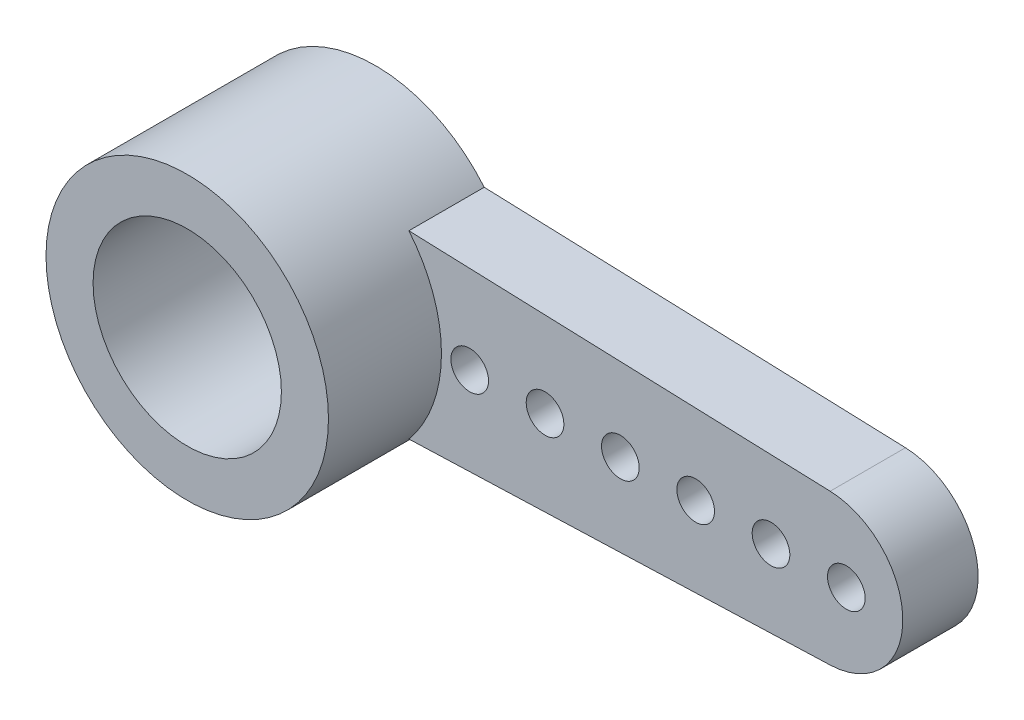
ISO-10303-21;
HEADER;
FILE_DESCRIPTION(('STEP AP214'),'2;1');
FILE_NAME('part.step','',(''),(''),'','','');
FILE_SCHEMA(('AUTOMOTIVE_DESIGN { 1 0 10303 214 1 1 1 1 }'));
ENDSEC;
DATA;
#1=APPLICATION_CONTEXT('core data for automotive mechanical design processes');
#2=APPLICATION_PROTOCOL_DEFINITION('international standard','automotive_design',2000,#1);
#3=PRODUCT_CONTEXT('',#1,'mechanical');
#4=PRODUCT('Part','Part','',(#3));
#5=PRODUCT_RELATED_PRODUCT_CATEGORY('part','',(#4));
#6=PRODUCT_DEFINITION_FORMATION('','',#4);
#7=PRODUCT_DEFINITION_CONTEXT('part definition',#1,'design');
#8=PRODUCT_DEFINITION('design','',#6,#7);
#9=PRODUCT_DEFINITION_SHAPE('','',#8);
#10=(LENGTH_UNIT() NAMED_UNIT(*) SI_UNIT(.MILLI.,.METRE.));
#11=(NAMED_UNIT(*) PLANE_ANGLE_UNIT() SI_UNIT($,.RADIAN.));
#12=(NAMED_UNIT(*) SI_UNIT($,.STERADIAN.) SOLID_ANGLE_UNIT());
#13=UNCERTAINTY_MEASURE_WITH_UNIT(LENGTH_MEASURE(1.E-05),#10,'distance_accuracy_value','');
#14=(GEOMETRIC_REPRESENTATION_CONTEXT(3) GLOBAL_UNCERTAINTY_ASSIGNED_CONTEXT((#13)) GLOBAL_UNIT_ASSIGNED_CONTEXT((#10,
#11,#12)) REPRESENTATION_CONTEXT('',''));
#15=CARTESIAN_POINT('',(0.,0.,0.));
#16=DIRECTION('',(0.,0.,1.));
#17=DIRECTION('',(1.,0.,0.));
#18=AXIS2_PLACEMENT_3D('',#15,#16,#17);
#19=CARTESIAN_POINT('',(0.,0.,0.));
#20=DIRECTION('',(0.,0.,1.));
#21=DIRECTION('',(1.,0.,0.));
#22=AXIS2_PLACEMENT_3D('',#19,#20,#21);
#23=PLANE('',#22);
#24=CARTESIAN_POINT('',(14.5,0.,0.));
#25=DIRECTION('',(0.,0.,-1.));
#26=DIRECTION('',(-1.,0.,0.));
#27=AXIS2_PLACEMENT_3D('',#24,#25,#26);
#28=CIRCLE('',#27,0.500000000000001);
#29=CARTESIAN_POINT('',(14.,0.,0.));
#30=VERTEX_POINT('',#29);
#31=EDGE_CURVE('E132',#30,#30,#28,.T.);
#32=ORIENTED_EDGE('',*,*,#31,.F.);
#33=EDGE_LOOP('',(#32));
#34=FACE_BOUND('',#33,.T.);
#35=CARTESIAN_POINT('',(10.5,0.,0.));
#36=DIRECTION('',(0.,0.,-1.));
#37=DIRECTION('',(-1.,0.,0.));
#38=AXIS2_PLACEMENT_3D('',#35,#36,#37);
#39=CIRCLE('',#38,0.500000000000001);
#40=CARTESIAN_POINT('',(10.,0.,0.));
#41=VERTEX_POINT('',#40);
#42=EDGE_CURVE('E135',#41,#41,#39,.T.);
#43=ORIENTED_EDGE('',*,*,#42,.F.);
#44=EDGE_LOOP('',(#43));
#45=FACE_BOUND('',#44,.T.);
#46=CARTESIAN_POINT('',(8.5,0.,0.));
#47=DIRECTION('',(0.,0.,-1.));
#48=DIRECTION('',(-1.,0.,0.));
#49=AXIS2_PLACEMENT_3D('',#46,#47,#48);
#50=CIRCLE('',#49,0.500000000000001);
#51=CARTESIAN_POINT('',(8.,0.,0.));
#52=VERTEX_POINT('',#51);
#53=EDGE_CURVE('E141',#52,#52,#50,.T.);
#54=ORIENTED_EDGE('',*,*,#53,.F.);
#55=EDGE_LOOP('',(#54));
#56=FACE_BOUND('',#55,.T.);
#57=CARTESIAN_POINT('',(6.5,0.,0.));
#58=DIRECTION('',(0.,0.,-1.));
#59=DIRECTION('',(-1.,0.,0.));
#60=AXIS2_PLACEMENT_3D('',#57,#58,#59);
#61=CIRCLE('',#60,0.500000000000001);
#62=CARTESIAN_POINT('',(6.,0.,0.));
#63=VERTEX_POINT('',#62);
#64=EDGE_CURVE('E147',#63,#63,#61,.T.);
#65=ORIENTED_EDGE('',*,*,#64,.F.);
#66=EDGE_LOOP('',(#65));
#67=FACE_BOUND('',#66,.T.);
#68=CARTESIAN_POINT('',(4.5,0.,0.));
#69=DIRECTION('',(0.,0.,-1.));
#70=DIRECTION('',(-1.,0.,0.));
#71=AXIS2_PLACEMENT_3D('',#68,#69,#70);
#72=CIRCLE('',#71,0.500000000000001);
#73=CARTESIAN_POINT('',(4.,0.,0.));
#74=VERTEX_POINT('',#73);
#75=EDGE_CURVE('E153',#74,#74,#72,.T.);
#76=ORIENTED_EDGE('',*,*,#75,.F.);
#77=EDGE_LOOP('',(#76));
#78=FACE_BOUND('',#77,.T.);
#79=CARTESIAN_POINT('',(12.5,0.,0.));
#80=DIRECTION('',(0.,0.,-1.));
#81=DIRECTION('',(-1.,0.,0.));
#82=AXIS2_PLACEMENT_3D('',#79,#80,#81);
#83=CIRCLE('',#82,0.500000000000001);
#84=CARTESIAN_POINT('',(12.,0.,0.));
#85=VERTEX_POINT('',#84);
#86=EDGE_CURVE('E159',#85,#85,#83,.T.);
#87=ORIENTED_EDGE('',*,*,#86,.F.);
#88=EDGE_LOOP('',(#87));
#89=FACE_BOUND('',#88,.T.);
#90=CARTESIAN_POINT('',(0.,0.,0.));
#91=DIRECTION('',(0.,0.,-1.));
#92=DIRECTION('',(-1.,0.,0.));
#93=AXIS2_PLACEMENT_3D('',#90,#91,#92);
#94=CIRCLE('',#93,2.5);
#95=CARTESIAN_POINT('',(-2.5,0.,0.));
#96=VERTEX_POINT('',#95);
#97=EDGE_CURVE('E171',#96,#96,#94,.T.);
#98=ORIENTED_EDGE('',*,*,#97,.F.);
#99=EDGE_LOOP('',(#98));
#100=FACE_BOUND('',#99,.T.);
#101=CARTESIAN_POINT('',(0.,0.,0.));
#102=DIRECTION('',(0.,0.,-1.));
#103=DIRECTION('',(-1.,0.,0.));
#104=AXIS2_PLACEMENT_3D('',#101,#102,#103);
#105=CIRCLE('',#104,3.75);
#106=CARTESIAN_POINT('',(2.88547071027724,-2.39511143376089,0.));
#107=VERTEX_POINT('',#106);
#108=CARTESIAN_POINT('',(2.88547071027724,2.39511143376089,0.));
#109=VERTEX_POINT('',#108);
#110=EDGE_CURVE('E45',#107,#109,#105,.T.);
#111=ORIENTED_EDGE('',*,*,#110,.T.);
#112=DIRECTION('',(-0.999372730394994,0.0354139201848023,0.));
#113=VECTOR('',#112,1.);
#114=CARTESIAN_POINT('',(0.0883858807695825,2.49422934631706,0.));
#115=LINE('',#114,#113);
#116=CARTESIAN_POINT('',(14.0708278403696,1.99874546078999,0.));
#117=VERTEX_POINT('',#116);
#118=EDGE_CURVE('E83',#117,#109,#115,.T.);
#119=ORIENTED_EDGE('',*,*,#118,.F.);
#120=CARTESIAN_POINT('',(14.,0.,0.));
#121=DIRECTION('',(0.,0.,1.));
#122=DIRECTION('',(1.,0.,0.));
#123=AXIS2_PLACEMENT_3D('',#120,#121,#122);
#124=CIRCLE('',#123,2.);
#125=CARTESIAN_POINT('',(14.0708278403696,-1.99874546078998,0.));
#126=VERTEX_POINT('',#125);
#127=EDGE_CURVE('E74',#126,#117,#124,.T.);
#128=ORIENTED_EDGE('',*,*,#127,.F.);
#129=DIRECTION('',(-0.999372730394994,-0.0354139201848029,0.));
#130=VECTOR('',#129,1.);
#131=CARTESIAN_POINT('',(0.0883858807695838,-2.49422934631706,0.));
#132=LINE('',#131,#130);
#133=EDGE_CURVE('E86',#126,#107,#132,.T.);
#134=ORIENTED_EDGE('',*,*,#133,.T.);
#135=EDGE_LOOP('',(#111,#119,#128,#134));
#136=FACE_BOUND('',#135,.T.);
#137=ADVANCED_FACE('F41',(#34,#45,#56,#67,#78,#89,#100,#136),#23,.F.);
#138=CARTESIAN_POINT('',(0.,0.,0.));
#139=DIRECTION('',(0.,0.,1.));
#140=DIRECTION('',(1.,0.,0.));
#141=AXIS2_PLACEMENT_3D('',#138,#139,#140);
#142=CYLINDRICAL_SURFACE('',#141,2.5);
#143=CARTESIAN_POINT('',(0.,0.,5.));
#144=DIRECTION('',(0.,0.,1.));
#145=DIRECTION('',(1.,0.,0.));
#146=AXIS2_PLACEMENT_3D('',#143,#144,#145);
#147=CIRCLE('',#146,2.5);
#148=CARTESIAN_POINT('',(2.5,0.,5.));
#149=VERTEX_POINT('',#148);
#150=EDGE_CURVE('E128',#149,#149,#147,.T.);
#151=ORIENTED_EDGE('',*,*,#150,.T.);
#152=EDGE_LOOP('',(#151));
#153=FACE_BOUND('',#152,.T.);
#154=CARTESIAN_POINT('',(0.,0.,1.));
#155=DIRECTION('',(0.,0.,-1.));
#156=DIRECTION('',(-1.,0.,0.));
#157=AXIS2_PLACEMENT_3D('',#154,#155,#156);
#158=CIRCLE('',#157,2.5);
#159=CARTESIAN_POINT('',(-2.5,0.,1.));
#160=VERTEX_POINT('',#159);
#161=EDGE_CURVE('E165',#160,#160,#158,.T.);
#162=ORIENTED_EDGE('',*,*,#161,.T.);
#163=EDGE_LOOP('',(#162));
#164=FACE_BOUND('',#163,.T.);
#165=ADVANCED_FACE('F200',(#153,#164),#142,.F.);
#166=CARTESIAN_POINT('',(0.0883858807695838,-2.49422934631706,2.));
#167=DIRECTION('',(0.0354139201848029,-0.999372730394994,0.));
#168=DIRECTION('',(0.999372730394994,0.0354139201848029,0.));
#169=AXIS2_PLACEMENT_3D('',#166,#167,#168);
#170=PLANE('',#169);
#171=ORIENTED_EDGE('',*,*,#133,.F.);
#172=DIRECTION('',(0.,0.,-1.));
#173=VECTOR('',#172,1.);
#174=CARTESIAN_POINT('',(14.0708278403696,-1.99874546078998,2.));
#175=LINE('',#174,#173);
#176=CARTESIAN_POINT('',(14.0708278403696,-1.99874546078998,2.));
#177=VERTEX_POINT('',#176);
#178=EDGE_CURVE('E52',#177,#126,#175,.T.);
#179=ORIENTED_EDGE('',*,*,#178,.F.);
#180=DIRECTION('',(-0.999372730394994,-0.0354139201848029,0.));
#181=VECTOR('',#180,1.);
#182=CARTESIAN_POINT('',(0.0883858807695838,-2.49422934631706,2.));
#183=LINE('',#182,#181);
#184=CARTESIAN_POINT('',(2.88547071027724,-2.39511143376089,2.));
#185=VERTEX_POINT('',#184);
#186=EDGE_CURVE('E102',#177,#185,#183,.T.);
#187=ORIENTED_EDGE('',*,*,#186,.T.);
#188=DIRECTION('',(0.,0.,-1.));
#189=VECTOR('',#188,1.);
#190=CARTESIAN_POINT('',(2.88547071027724,-2.39511143376089,2.));
#191=LINE('',#190,#189);
#192=EDGE_CURVE('E99',#185,#107,#191,.T.);
#193=ORIENTED_EDGE('',*,*,#192,.T.);
#194=EDGE_LOOP('',(#171,#179,#187,#193));
#195=FACE_BOUND('',#194,.T.);
#196=ADVANCED_FACE('F43',(#195),#170,.T.);
#197=CARTESIAN_POINT('',(14.,0.,2.));
#198=DIRECTION('',(0.,0.,-1.));
#199=DIRECTION('',(-1.,0.,0.));
#200=AXIS2_PLACEMENT_3D('',#197,#198,#199);
#201=CYLINDRICAL_SURFACE('',#200,2.);
#202=ORIENTED_EDGE('',*,*,#127,.T.);
#203=DIRECTION('',(0.,0.,-1.));
#204=VECTOR('',#203,1.);
#205=CARTESIAN_POINT('',(14.0708278403696,1.99874546078999,2.));
#206=LINE('',#205,#204);
#207=CARTESIAN_POINT('',(14.0708278403696,1.99874546078999,2.));
#208=VERTEX_POINT('',#207);
#209=EDGE_CURVE('E98',#208,#117,#206,.T.);
#210=ORIENTED_EDGE('',*,*,#209,.F.);
#211=CARTESIAN_POINT('',(14.,0.,2.));
#212=DIRECTION('',(0.,0.,1.));
#213=DIRECTION('',(1.,0.,0.));
#214=AXIS2_PLACEMENT_3D('',#211,#212,#213);
#215=CIRCLE('',#214,2.);
#216=EDGE_CURVE('E61',#177,#208,#215,.T.);
#217=ORIENTED_EDGE('',*,*,#216,.F.);
#218=ORIENTED_EDGE('',*,*,#178,.T.);
#219=EDGE_LOOP('',(#202,#210,#217,#218));
#220=FACE_BOUND('',#219,.T.);
#221=ADVANCED_FACE('F217',(#220),#201,.T.);
#222=CARTESIAN_POINT('',(0.0883858807695825,2.49422934631706,2.));
#223=DIRECTION('',(-0.0354139201848023,-0.999372730394994,0.));
#224=DIRECTION('',(0.999372730394994,-0.0354139201848023,0.));
#225=AXIS2_PLACEMENT_3D('',#222,#223,#224);
#226=PLANE('',#225);
#227=ORIENTED_EDGE('',*,*,#118,.T.);
#228=DIRECTION('',(0.,0.,-1.));
#229=VECTOR('',#228,1.);
#230=CARTESIAN_POINT('',(2.88547071027724,2.39511143376089,2.));
#231=LINE('',#230,#229);
#232=CARTESIAN_POINT('',(2.88547071027724,2.39511143376089,2.));
#233=VERTEX_POINT('',#232);
#234=EDGE_CURVE('E92',#233,#109,#231,.T.);
#235=ORIENTED_EDGE('',*,*,#234,.F.);
#236=DIRECTION('',(-0.999372730394994,0.0354139201848023,0.));
#237=VECTOR('',#236,1.);
#238=CARTESIAN_POINT('',(0.0883858807695825,2.49422934631706,2.));
#239=LINE('',#238,#237);
#240=EDGE_CURVE('E118',#208,#233,#239,.T.);
#241=ORIENTED_EDGE('',*,*,#240,.F.);
#242=ORIENTED_EDGE('',*,*,#209,.T.);
#243=EDGE_LOOP('',(#227,#235,#241,#242));
#244=FACE_BOUND('',#243,.T.);
#245=ADVANCED_FACE('F101',(#244),#226,.F.);
#246=CARTESIAN_POINT('',(0.,0.,2.));
#247=DIRECTION('',(0.,0.,1.));
#248=DIRECTION('',(1.,0.,0.));
#249=AXIS2_PLACEMENT_3D('',#246,#247,#248);
#250=PLANE('',#249);
#251=CARTESIAN_POINT('',(12.5,0.,2.));
#252=DIRECTION('',(0.,0.,-1.));
#253=DIRECTION('',(-1.,0.,0.));
#254=AXIS2_PLACEMENT_3D('',#251,#252,#253);
#255=CIRCLE('',#254,0.500000000000001);
#256=CARTESIAN_POINT('',(12.,0.,2.));
#257=VERTEX_POINT('',#256);
#258=EDGE_CURVE('E162',#257,#257,#255,.T.);
#259=ORIENTED_EDGE('',*,*,#258,.T.);
#260=EDGE_LOOP('',(#259));
#261=FACE_BOUND('',#260,.T.);
#262=CARTESIAN_POINT('',(4.5,0.,2.));
#263=DIRECTION('',(0.,0.,-1.));
#264=DIRECTION('',(-1.,0.,0.));
#265=AXIS2_PLACEMENT_3D('',#262,#263,#264);
#266=CIRCLE('',#265,0.500000000000001);
#267=CARTESIAN_POINT('',(4.,0.,2.));
#268=VERTEX_POINT('',#267);
#269=EDGE_CURVE('E156',#268,#268,#266,.T.);
#270=ORIENTED_EDGE('',*,*,#269,.T.);
#271=EDGE_LOOP('',(#270));
#272=FACE_BOUND('',#271,.T.);
#273=CARTESIAN_POINT('',(6.5,0.,2.));
#274=DIRECTION('',(0.,0.,-1.));
#275=DIRECTION('',(-1.,0.,0.));
#276=AXIS2_PLACEMENT_3D('',#273,#274,#275);
#277=CIRCLE('',#276,0.500000000000001);
#278=CARTESIAN_POINT('',(6.,0.,2.));
#279=VERTEX_POINT('',#278);
#280=EDGE_CURVE('E150',#279,#279,#277,.T.);
#281=ORIENTED_EDGE('',*,*,#280,.T.);
#282=EDGE_LOOP('',(#281));
#283=FACE_BOUND('',#282,.T.);
#284=CARTESIAN_POINT('',(8.5,0.,2.));
#285=DIRECTION('',(0.,0.,-1.));
#286=DIRECTION('',(-1.,0.,0.));
#287=AXIS2_PLACEMENT_3D('',#284,#285,#286);
#288=CIRCLE('',#287,0.500000000000001);
#289=CARTESIAN_POINT('',(8.,0.,2.));
#290=VERTEX_POINT('',#289);
#291=EDGE_CURVE('E144',#290,#290,#288,.T.);
#292=ORIENTED_EDGE('',*,*,#291,.T.);
#293=EDGE_LOOP('',(#292));
#294=FACE_BOUND('',#293,.T.);
#295=CARTESIAN_POINT('',(10.5,0.,2.));
#296=DIRECTION('',(0.,0.,-1.));
#297=DIRECTION('',(-1.,0.,0.));
#298=AXIS2_PLACEMENT_3D('',#295,#296,#297);
#299=CIRCLE('',#298,0.500000000000001);
#300=CARTESIAN_POINT('',(10.,0.,2.));
#301=VERTEX_POINT('',#300);
#302=EDGE_CURVE('E138',#301,#301,#299,.T.);
#303=ORIENTED_EDGE('',*,*,#302,.T.);
#304=EDGE_LOOP('',(#303));
#305=FACE_BOUND('',#304,.T.);
#306=CARTESIAN_POINT('',(14.5,0.,2.));
#307=DIRECTION('',(0.,0.,-1.));
#308=DIRECTION('',(-1.,0.,0.));
#309=AXIS2_PLACEMENT_3D('',#306,#307,#308);
#310=CIRCLE('',#309,0.500000000000001);
#311=CARTESIAN_POINT('',(14.,0.,2.));
#312=VERTEX_POINT('',#311);
#313=EDGE_CURVE('E131',#312,#312,#310,.T.);
#314=ORIENTED_EDGE('',*,*,#313,.T.);
#315=EDGE_LOOP('',(#314));
#316=FACE_BOUND('',#315,.T.);
#317=CARTESIAN_POINT('',(0.,0.,2.));
#318=DIRECTION('',(0.,0.,1.));
#319=DIRECTION('',(1.,0.,0.));
#320=AXIS2_PLACEMENT_3D('',#317,#318,#319);
#321=CIRCLE('',#320,3.75);
#322=EDGE_CURVE('E12',#185,#233,#321,.T.);
#323=ORIENTED_EDGE('',*,*,#322,.F.);
#324=ORIENTED_EDGE('',*,*,#186,.F.);
#325=ORIENTED_EDGE('',*,*,#216,.T.);
#326=ORIENTED_EDGE('',*,*,#240,.T.);
#327=EDGE_LOOP('',(#323,#324,#325,#326));
#328=FACE_BOUND('',#327,.T.);
#329=ADVANCED_FACE('F214',(#261,#272,#283,#294,#305,#316,#328),#250,.T.);
#330=CARTESIAN_POINT('',(0.,0.,0.));
#331=DIRECTION('',(0.,0.,1.));
#332=DIRECTION('',(1.,0.,0.));
#333=AXIS2_PLACEMENT_3D('',#330,#331,#332);
#334=CYLINDRICAL_SURFACE('',#333,3.75);
#335=CARTESIAN_POINT('',(0.,0.,5.));
#336=DIRECTION('',(0.,0.,1.));
#337=DIRECTION('',(1.,0.,0.));
#338=AXIS2_PLACEMENT_3D('',#335,#336,#337);
#339=CIRCLE('',#338,3.75);
#340=CARTESIAN_POINT('',(3.75,0.,5.));
#341=VERTEX_POINT('',#340);
#342=EDGE_CURVE('E90',#341,#341,#339,.T.);
#343=ORIENTED_EDGE('',*,*,#342,.F.);
#344=EDGE_LOOP('',(#343));
#345=FACE_BOUND('',#344,.T.);
#346=ORIENTED_EDGE('',*,*,#234,.T.);
#347=ORIENTED_EDGE('',*,*,#110,.F.);
#348=ORIENTED_EDGE('',*,*,#192,.F.);
#349=ORIENTED_EDGE('',*,*,#322,.T.);
#350=EDGE_LOOP('',(#346,#347,#348,#349));
#351=FACE_BOUND('',#350,.T.);
#352=ADVANCED_FACE('F93',(#345,#351),#334,.T.);
#353=CARTESIAN_POINT('',(0.,0.,5.));
#354=DIRECTION('',(0.,0.,1.));
#355=DIRECTION('',(1.,0.,0.));
#356=AXIS2_PLACEMENT_3D('',#353,#354,#355);
#357=PLANE('',#356);
#358=ORIENTED_EDGE('',*,*,#342,.T.);
#359=EDGE_LOOP('',(#358));
#360=FACE_BOUND('',#359,.T.);
#361=ORIENTED_EDGE('',*,*,#150,.F.);
#362=EDGE_LOOP('',(#361));
#363=FACE_BOUND('',#362,.T.);
#364=ADVANCED_FACE('F232',(#360,#363),#357,.T.);
#365=CARTESIAN_POINT('',(14.5,0.,2.));
#366=DIRECTION('',(0.,0.,-1.));
#367=DIRECTION('',(-1.,0.,0.));
#368=AXIS2_PLACEMENT_3D('',#365,#366,#367);
#369=CYLINDRICAL_SURFACE('',#368,0.500000000000001);
#370=ORIENTED_EDGE('',*,*,#313,.F.);
#371=EDGE_LOOP('',(#370));
#372=FACE_BOUND('',#371,.T.);
#373=ORIENTED_EDGE('',*,*,#31,.T.);
#374=EDGE_LOOP('',(#373));
#375=FACE_BOUND('',#374,.T.);
#376=ADVANCED_FACE('F246',(#372,#375),#369,.F.);
#377=CARTESIAN_POINT('',(10.5,0.,2.));
#378=DIRECTION('',(0.,0.,-1.));
#379=DIRECTION('',(-1.,0.,0.));
#380=AXIS2_PLACEMENT_3D('',#377,#378,#379);
#381=CYLINDRICAL_SURFACE('',#380,0.500000000000001);
#382=ORIENTED_EDGE('',*,*,#302,.F.);
#383=EDGE_LOOP('',(#382));
#384=FACE_BOUND('',#383,.T.);
#385=ORIENTED_EDGE('',*,*,#42,.T.);
#386=EDGE_LOOP('',(#385));
#387=FACE_BOUND('',#386,.T.);
#388=ADVANCED_FACE('F249',(#384,#387),#381,.F.);
#389=CARTESIAN_POINT('',(8.5,0.,2.));
#390=DIRECTION('',(0.,0.,-1.));
#391=DIRECTION('',(-1.,0.,0.));
#392=AXIS2_PLACEMENT_3D('',#389,#390,#391);
#393=CYLINDRICAL_SURFACE('',#392,0.500000000000001);
#394=ORIENTED_EDGE('',*,*,#291,.F.);
#395=EDGE_LOOP('',(#394));
#396=FACE_BOUND('',#395,.T.);
#397=ORIENTED_EDGE('',*,*,#53,.T.);
#398=EDGE_LOOP('',(#397));
#399=FACE_BOUND('',#398,.T.);
#400=ADVANCED_FACE('F254',(#396,#399),#393,.F.);
#401=CARTESIAN_POINT('',(6.5,0.,2.));
#402=DIRECTION('',(0.,0.,-1.));
#403=DIRECTION('',(-1.,0.,0.));
#404=AXIS2_PLACEMENT_3D('',#401,#402,#403);
#405=CYLINDRICAL_SURFACE('',#404,0.500000000000001);
#406=ORIENTED_EDGE('',*,*,#280,.F.);
#407=EDGE_LOOP('',(#406));
#408=FACE_BOUND('',#407,.T.);
#409=ORIENTED_EDGE('',*,*,#64,.T.);
#410=EDGE_LOOP('',(#409));
#411=FACE_BOUND('',#410,.T.);
#412=ADVANCED_FACE('F263',(#408,#411),#405,.F.);
#413=CARTESIAN_POINT('',(4.5,0.,2.));
#414=DIRECTION('',(0.,0.,-1.));
#415=DIRECTION('',(-1.,0.,0.));
#416=AXIS2_PLACEMENT_3D('',#413,#414,#415);
#417=CYLINDRICAL_SURFACE('',#416,0.500000000000001);
#418=ORIENTED_EDGE('',*,*,#269,.F.);
#419=EDGE_LOOP('',(#418));
#420=FACE_BOUND('',#419,.T.);
#421=ORIENTED_EDGE('',*,*,#75,.T.);
#422=EDGE_LOOP('',(#421));
#423=FACE_BOUND('',#422,.T.);
#424=ADVANCED_FACE('F267',(#420,#423),#417,.F.);
#425=CARTESIAN_POINT('',(12.5,0.,2.));
#426=DIRECTION('',(0.,0.,-1.));
#427=DIRECTION('',(-1.,0.,0.));
#428=AXIS2_PLACEMENT_3D('',#425,#426,#427);
#429=CYLINDRICAL_SURFACE('',#428,0.500000000000001);
#430=ORIENTED_EDGE('',*,*,#258,.F.);
#431=EDGE_LOOP('',(#430));
#432=FACE_BOUND('',#431,.T.);
#433=ORIENTED_EDGE('',*,*,#86,.T.);
#434=EDGE_LOOP('',(#433));
#435=FACE_BOUND('',#434,.T.);
#436=ADVANCED_FACE('F271',(#432,#435),#429,.F.);
#437=CARTESIAN_POINT('',(0.,0.,1.));
#438=DIRECTION('',(0.,0.,-1.));
#439=DIRECTION('',(-1.,0.,0.));
#440=AXIS2_PLACEMENT_3D('',#437,#438,#439);
#441=PLANE('',#440);
#442=CARTESIAN_POINT('',(0.,0.,1.));
#443=DIRECTION('',(0.,0.,-1.));
#444=DIRECTION('',(-1.,0.,0.));
#445=AXIS2_PLACEMENT_3D('',#442,#443,#444);
#446=CIRCLE('',#445,1.25);
#447=CARTESIAN_POINT('',(-1.25,0.,1.));
#448=VERTEX_POINT('',#447);
#449=EDGE_CURVE('E174',#448,#448,#446,.T.);
#450=ORIENTED_EDGE('',*,*,#449,.T.);
#451=EDGE_LOOP('',(#450));
#452=FACE_BOUND('',#451,.T.);
#453=ORIENTED_EDGE('',*,*,#161,.F.);
#454=EDGE_LOOP('',(#453));
#455=FACE_BOUND('',#454,.T.);
#456=ADVANCED_FACE('F195',(#452,#455),#441,.F.);
#457=CARTESIAN_POINT('',(0.,0.,0.5));
#458=DIRECTION('',(0.,0.,-1.));
#459=DIRECTION('',(-1.,0.,0.));
#460=AXIS2_PLACEMENT_3D('',#457,#458,#459);
#461=CYLINDRICAL_SURFACE('',#460,2.5);
#462=CARTESIAN_POINT('',(0.,0.,0.5));
#463=DIRECTION('',(0.,0.,-1.));
#464=DIRECTION('',(-1.,0.,0.));
#465=AXIS2_PLACEMENT_3D('',#462,#463,#464);
#466=CIRCLE('',#465,2.5);
#467=CARTESIAN_POINT('',(-2.5,0.,0.5));
#468=VERTEX_POINT('',#467);
#469=EDGE_CURVE('E170',#468,#468,#466,.T.);
#470=ORIENTED_EDGE('',*,*,#469,.F.);
#471=EDGE_LOOP('',(#470));
#472=FACE_BOUND('',#471,.T.);
#473=ORIENTED_EDGE('',*,*,#97,.T.);
#474=EDGE_LOOP('',(#473));
#475=FACE_BOUND('',#474,.T.);
#476=ADVANCED_FACE('F189',(#472,#475),#461,.F.);
#477=CARTESIAN_POINT('',(0.,0.,0.5));
#478=DIRECTION('',(0.,0.,-1.));
#479=DIRECTION('',(-1.,0.,0.));
#480=AXIS2_PLACEMENT_3D('',#477,#478,#479);
#481=PLANE('',#480);
#482=CARTESIAN_POINT('',(0.,0.,0.5));
#483=DIRECTION('',(0.,0.,-1.));
#484=DIRECTION('',(-1.,0.,0.));
#485=AXIS2_PLACEMENT_3D('',#482,#483,#484);
#486=CIRCLE('',#485,1.25);
#487=CARTESIAN_POINT('',(-1.25,0.,0.5));
#488=VERTEX_POINT('',#487);
#489=EDGE_CURVE('E179',#488,#488,#486,.T.);
#490=ORIENTED_EDGE('',*,*,#489,.F.);
#491=EDGE_LOOP('',(#490));
#492=FACE_BOUND('',#491,.T.);
#493=ORIENTED_EDGE('',*,*,#469,.T.);
#494=EDGE_LOOP('',(#493));
#495=FACE_BOUND('',#494,.T.);
#496=ADVANCED_FACE('F186',(#492,#495),#481,.T.);
#497=CARTESIAN_POINT('',(0.,0.,5.5));
#498=DIRECTION('',(0.,0.,-1.));
#499=DIRECTION('',(-1.,0.,0.));
#500=AXIS2_PLACEMENT_3D('',#497,#498,#499);
#501=CYLINDRICAL_SURFACE('',#500,1.25);
#502=ORIENTED_EDGE('',*,*,#489,.T.);
#503=EDGE_LOOP('',(#502));
#504=FACE_BOUND('',#503,.T.);
#505=ORIENTED_EDGE('',*,*,#449,.F.);
#506=EDGE_LOOP('',(#505));
#507=FACE_BOUND('',#506,.T.);
#508=ADVANCED_FACE('F183',(#504,#507),#501,.F.);
#509=CLOSED_SHELL('',(#137,#165,#196,#221,#245,#329,#352,#364,#376,#388,#400,#412,#424,#436,
#456,#476,#496,#508));
#510=MANIFOLD_SOLID_BREP('B2',#509);
#511=ADVANCED_BREP_SHAPE_REPRESENTATION('',(#18,#510),#14);
#512=SHAPE_DEFINITION_REPRESENTATION(#9,#511);
ENDSEC;
END-ISO-10303-21;
